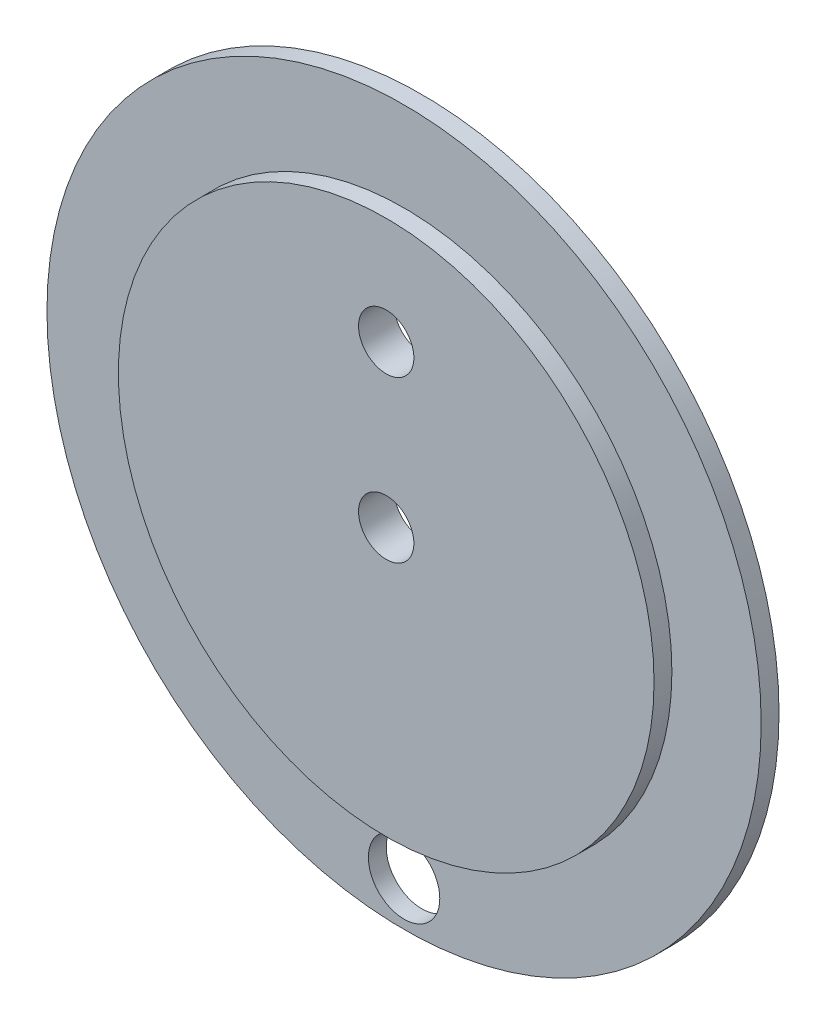
ISO-10303-21;
HEADER;
FILE_DESCRIPTION(('STEP AP214'),'2;1');
FILE_NAME('part.step','',(''),(''),'','','');
FILE_SCHEMA(('AUTOMOTIVE_DESIGN { 1 0 10303 214 1 1 1 1 }'));
ENDSEC;
DATA;
#1=APPLICATION_CONTEXT('core data for automotive mechanical design processes');
#2=APPLICATION_PROTOCOL_DEFINITION('international standard','automotive_design',2000,#1);
#3=PRODUCT_CONTEXT('',#1,'mechanical');
#4=PRODUCT('Part','Part','',(#3));
#5=PRODUCT_RELATED_PRODUCT_CATEGORY('part','',(#4));
#6=PRODUCT_DEFINITION_FORMATION('','',#4);
#7=PRODUCT_DEFINITION_CONTEXT('part definition',#1,'design');
#8=PRODUCT_DEFINITION('design','',#6,#7);
#9=PRODUCT_DEFINITION_SHAPE('','',#8);
#10=(LENGTH_UNIT() NAMED_UNIT(*) SI_UNIT(.MILLI.,.METRE.));
#11=(NAMED_UNIT(*) PLANE_ANGLE_UNIT() SI_UNIT($,.RADIAN.));
#12=(NAMED_UNIT(*) SI_UNIT($,.STERADIAN.) SOLID_ANGLE_UNIT());
#13=UNCERTAINTY_MEASURE_WITH_UNIT(LENGTH_MEASURE(1.E-05),#10,'distance_accuracy_value','');
#14=(GEOMETRIC_REPRESENTATION_CONTEXT(3) GLOBAL_UNCERTAINTY_ASSIGNED_CONTEXT((#13)) GLOBAL_UNIT_ASSIGNED_CONTEXT((#10,
#11,#12)) REPRESENTATION_CONTEXT('',''));
#15=CARTESIAN_POINT('',(0.,0.,0.));
#16=DIRECTION('',(0.,0.,1.));
#17=DIRECTION('',(1.,0.,0.));
#18=AXIS2_PLACEMENT_3D('',#15,#16,#17);
#19=CARTESIAN_POINT('',(0.,0.,1.));
#20=DIRECTION('',(0.,0.,-1.));
#21=DIRECTION('',(-1.,0.,0.));
#22=AXIS2_PLACEMENT_3D('',#19,#20,#21);
#23=CYLINDRICAL_SURFACE('',#22,20.);
#24=CARTESIAN_POINT('',(0.,0.,1.));
#25=DIRECTION('',(0.,0.,1.));
#26=DIRECTION('',(1.,0.,0.));
#27=AXIS2_PLACEMENT_3D('',#24,#25,#26);
#28=CIRCLE('',#27,20.);
#29=CARTESIAN_POINT('',(20.,0.,1.));
#30=VERTEX_POINT('',#29);
#31=EDGE_CURVE('E58',#30,#30,#28,.T.);
#32=ORIENTED_EDGE('',*,*,#31,.F.);
#33=EDGE_LOOP('',(#32));
#34=FACE_BOUND('',#33,.T.);
#35=CARTESIAN_POINT('',(0.,0.,0.));
#36=DIRECTION('',(0.,0.,1.));
#37=DIRECTION('',(1.,0.,0.));
#38=AXIS2_PLACEMENT_3D('',#35,#36,#37);
#39=CIRCLE('',#38,20.);
#40=CARTESIAN_POINT('',(20.,0.,0.));
#41=VERTEX_POINT('',#40);
#42=EDGE_CURVE('E53',#41,#41,#39,.T.);
#43=ORIENTED_EDGE('',*,*,#42,.T.);
#44=EDGE_LOOP('',(#43));
#45=FACE_BOUND('',#44,.T.);
#46=ADVANCED_FACE('F49',(#34,#45),#23,.T.);
#47=CARTESIAN_POINT('',(0.,-17.5,1.));
#48=DIRECTION('',(0.,0.,-1.));
#49=DIRECTION('',(-1.,0.,0.));
#50=AXIS2_PLACEMENT_3D('',#47,#48,#49);
#51=CYLINDRICAL_SURFACE('',#50,2.);
#52=CARTESIAN_POINT('',(0.,-17.5,1.));
#53=DIRECTION('',(0.,0.,1.));
#54=DIRECTION('',(1.,0.,0.));
#55=AXIS2_PLACEMENT_3D('',#52,#53,#54);
#56=CIRCLE('',#55,2.);
#57=CARTESIAN_POINT('',(2.,-17.5,1.));
#58=VERTEX_POINT('',#57);
#59=EDGE_CURVE('E67',#58,#58,#56,.T.);
#60=ORIENTED_EDGE('',*,*,#59,.T.);
#61=EDGE_LOOP('',(#60));
#62=FACE_BOUND('',#61,.T.);
#63=CARTESIAN_POINT('',(0.,-17.5,0.));
#64=DIRECTION('',(0.,0.,1.));
#65=DIRECTION('',(1.,0.,0.));
#66=AXIS2_PLACEMENT_3D('',#63,#64,#65);
#67=CIRCLE('',#66,2.);
#68=CARTESIAN_POINT('',(2.,-17.5,0.));
#69=VERTEX_POINT('',#68);
#70=EDGE_CURVE('E70',#69,#69,#67,.T.);
#71=ORIENTED_EDGE('',*,*,#70,.F.);
#72=EDGE_LOOP('',(#71));
#73=FACE_BOUND('',#72,.T.);
#74=ADVANCED_FACE('F51',(#62,#73),#51,.F.);
#75=CARTESIAN_POINT('',(0.,0.,1.));
#76=DIRECTION('',(0.,0.,1.));
#77=DIRECTION('',(1.,0.,0.));
#78=AXIS2_PLACEMENT_3D('',#75,#76,#77);
#79=PLANE('',#78);
#80=ORIENTED_EDGE('',*,*,#59,.F.);
#81=EDGE_LOOP('',(#80));
#82=FACE_BOUND('',#81,.T.);
#83=ORIENTED_EDGE('',*,*,#31,.T.);
#84=EDGE_LOOP('',(#83));
#85=FACE_BOUND('',#84,.T.);
#86=CARTESIAN_POINT('',(0.,0.,1.));
#87=DIRECTION('',(0.,0.,1.));
#88=DIRECTION('',(1.,0.,0.));
#89=AXIS2_PLACEMENT_3D('',#86,#87,#88);
#90=CIRCLE('',#89,15.);
#91=CARTESIAN_POINT('',(15.,0.,1.));
#92=VERTEX_POINT('',#91);
#93=EDGE_CURVE('E10',#92,#92,#90,.T.);
#94=ORIENTED_EDGE('',*,*,#93,.F.);
#95=EDGE_LOOP('',(#94));
#96=FACE_BOUND('',#95,.T.);
#97=ADVANCED_FACE('F105',(#82,#85,#96),#79,.T.);
#98=CARTESIAN_POINT('',(0.,0.,0.));
#99=DIRECTION('',(0.,0.,1.));
#100=DIRECTION('',(1.,0.,0.));
#101=AXIS2_PLACEMENT_3D('',#98,#99,#100);
#102=PLANE('',#101);
#103=ORIENTED_EDGE('',*,*,#70,.T.);
#104=EDGE_LOOP('',(#103));
#105=FACE_BOUND('',#104,.T.);
#106=ORIENTED_EDGE('',*,*,#42,.F.);
#107=EDGE_LOOP('',(#106));
#108=FACE_BOUND('',#107,.T.);
#109=CARTESIAN_POINT('',(0.,9.,0.));
#110=DIRECTION('',(0.,0.,1.));
#111=DIRECTION('',(1.,0.,0.));
#112=AXIS2_PLACEMENT_3D('',#109,#110,#111);
#113=CIRCLE('',#112,1.55);
#114=CARTESIAN_POINT('',(1.55,9.,0.));
#115=VERTEX_POINT('',#114);
#116=EDGE_CURVE('E92',#115,#115,#113,.T.);
#117=ORIENTED_EDGE('',*,*,#116,.T.);
#118=EDGE_LOOP('',(#117));
#119=FACE_BOUND('',#118,.T.);
#120=CARTESIAN_POINT('',(0.,0.,0.));
#121=DIRECTION('',(0.,0.,1.));
#122=DIRECTION('',(1.,0.,0.));
#123=AXIS2_PLACEMENT_3D('',#120,#121,#122);
#124=CIRCLE('',#123,1.55);
#125=CARTESIAN_POINT('',(1.55,0.,0.));
#126=VERTEX_POINT('',#125);
#127=EDGE_CURVE('E95',#126,#126,#124,.T.);
#128=ORIENTED_EDGE('',*,*,#127,.T.);
#129=EDGE_LOOP('',(#128));
#130=FACE_BOUND('',#129,.T.);
#131=ADVANCED_FACE('F108',(#105,#108,#119,#130),#102,.F.);
#132=CARTESIAN_POINT('',(0.,0.,2.));
#133=DIRECTION('',(0.,0.,-1.));
#134=DIRECTION('',(-1.,0.,0.));
#135=AXIS2_PLACEMENT_3D('',#132,#133,#134);
#136=CYLINDRICAL_SURFACE('',#135,1.55);
#137=CARTESIAN_POINT('',(0.,0.,2.));
#138=DIRECTION('',(0.,0.,1.));
#139=DIRECTION('',(1.,0.,0.));
#140=AXIS2_PLACEMENT_3D('',#137,#138,#139);
#141=CIRCLE('',#140,1.55);
#142=CARTESIAN_POINT('',(1.55,0.,2.));
#143=VERTEX_POINT('',#142);
#144=EDGE_CURVE('E81',#143,#143,#141,.T.);
#145=ORIENTED_EDGE('',*,*,#144,.T.);
#146=EDGE_LOOP('',(#145));
#147=FACE_BOUND('',#146,.T.);
#148=ORIENTED_EDGE('',*,*,#127,.F.);
#149=EDGE_LOOP('',(#148));
#150=FACE_BOUND('',#149,.T.);
#151=ADVANCED_FACE('F119',(#147,#150),#136,.F.);
#152=CARTESIAN_POINT('',(0.,9.,2.));
#153=DIRECTION('',(0.,0.,-1.));
#154=DIRECTION('',(-1.,0.,0.));
#155=AXIS2_PLACEMENT_3D('',#152,#153,#154);
#156=CYLINDRICAL_SURFACE('',#155,1.55);
#157=CARTESIAN_POINT('',(0.,9.,2.));
#158=DIRECTION('',(0.,0.,1.));
#159=DIRECTION('',(1.,0.,0.));
#160=AXIS2_PLACEMENT_3D('',#157,#158,#159);
#161=CIRCLE('',#160,1.55);
#162=CARTESIAN_POINT('',(1.55,9.,2.));
#163=VERTEX_POINT('',#162);
#164=EDGE_CURVE('E88',#163,#163,#161,.T.);
#165=ORIENTED_EDGE('',*,*,#164,.T.);
#166=EDGE_LOOP('',(#165));
#167=FACE_BOUND('',#166,.T.);
#168=ORIENTED_EDGE('',*,*,#116,.F.);
#169=EDGE_LOOP('',(#168));
#170=FACE_BOUND('',#169,.T.);
#171=ADVANCED_FACE('F126',(#167,#170),#156,.F.);
#172=CARTESIAN_POINT('',(0.,0.,2.));
#173=DIRECTION('',(0.,0.,-1.));
#174=DIRECTION('',(-1.,0.,0.));
#175=AXIS2_PLACEMENT_3D('',#172,#173,#174);
#176=CYLINDRICAL_SURFACE('',#175,15.);
#177=ORIENTED_EDGE('',*,*,#93,.T.);
#178=EDGE_LOOP('',(#177));
#179=FACE_BOUND('',#178,.T.);
#180=CARTESIAN_POINT('',(0.,0.,2.));
#181=DIRECTION('',(0.,0.,1.));
#182=DIRECTION('',(1.,0.,0.));
#183=AXIS2_PLACEMENT_3D('',#180,#181,#182);
#184=CIRCLE('',#183,15.);
#185=CARTESIAN_POINT('',(15.,0.,2.));
#186=VERTEX_POINT('',#185);
#187=EDGE_CURVE('E73',#186,#186,#184,.T.);
#188=ORIENTED_EDGE('',*,*,#187,.F.);
#189=EDGE_LOOP('',(#188));
#190=FACE_BOUND('',#189,.T.);
#191=ADVANCED_FACE('F131',(#179,#190),#176,.T.);
#192=CARTESIAN_POINT('',(0.,0.,2.));
#193=DIRECTION('',(0.,0.,1.));
#194=DIRECTION('',(1.,0.,0.));
#195=AXIS2_PLACEMENT_3D('',#192,#193,#194);
#196=PLANE('',#195);
#197=ORIENTED_EDGE('',*,*,#164,.F.);
#198=EDGE_LOOP('',(#197));
#199=FACE_BOUND('',#198,.T.);
#200=ORIENTED_EDGE('',*,*,#144,.F.);
#201=EDGE_LOOP('',(#200));
#202=FACE_BOUND('',#201,.T.);
#203=ORIENTED_EDGE('',*,*,#187,.T.);
#204=EDGE_LOOP('',(#203));
#205=FACE_BOUND('',#204,.T.);
#206=ADVANCED_FACE('F137',(#199,#202,#205),#196,.T.);
#207=CLOSED_SHELL('',(#46,#74,#97,#131,#151,#171,#191,#206));
#208=MANIFOLD_SOLID_BREP('B2',#207);
#209=ADVANCED_BREP_SHAPE_REPRESENTATION('',(#18,#208),#14);
#210=SHAPE_DEFINITION_REPRESENTATION(#9,#209);
ENDSEC;
END-ISO-10303-21;
